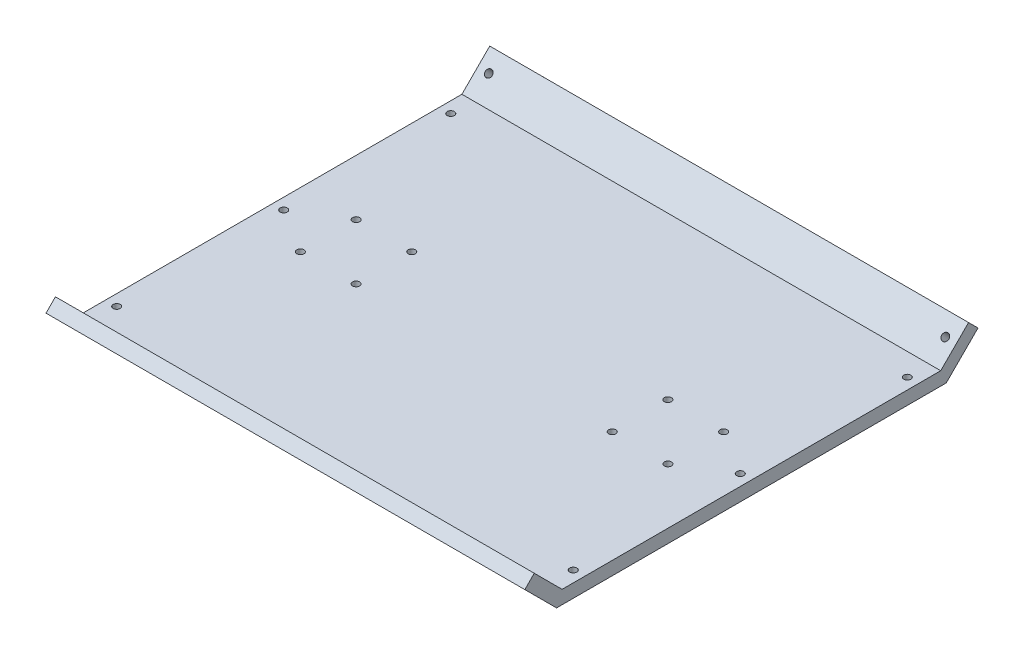
ISO-10303-21;
HEADER;
FILE_DESCRIPTION(('STEP AP214'),'2;1');
FILE_NAME('part.step','',(''),(''),'','','');
FILE_SCHEMA(('AUTOMOTIVE_DESIGN { 1 0 10303 214 1 1 1 1 }'));
ENDSEC;
DATA;
#1=APPLICATION_CONTEXT('core data for automotive mechanical design processes');
#2=APPLICATION_PROTOCOL_DEFINITION('international standard','automotive_design',2000,#1);
#3=PRODUCT_CONTEXT('',#1,'mechanical');
#4=PRODUCT('Part','Part','',(#3));
#5=PRODUCT_RELATED_PRODUCT_CATEGORY('part','',(#4));
#6=PRODUCT_DEFINITION_FORMATION('','',#4);
#7=PRODUCT_DEFINITION_CONTEXT('part definition',#1,'design');
#8=PRODUCT_DEFINITION('design','',#6,#7);
#9=PRODUCT_DEFINITION_SHAPE('','',#8);
#10=(LENGTH_UNIT() NAMED_UNIT(*) SI_UNIT(.MILLI.,.METRE.));
#11=(NAMED_UNIT(*) PLANE_ANGLE_UNIT() SI_UNIT($,.RADIAN.));
#12=(NAMED_UNIT(*) SI_UNIT($,.STERADIAN.) SOLID_ANGLE_UNIT());
#13=UNCERTAINTY_MEASURE_WITH_UNIT(LENGTH_MEASURE(1.E-05),#10,'distance_accuracy_value','');
#14=(GEOMETRIC_REPRESENTATION_CONTEXT(3) GLOBAL_UNCERTAINTY_ASSIGNED_CONTEXT((#13)) GLOBAL_UNIT_ASSIGNED_CONTEXT((#10,
#11,#12)) REPRESENTATION_CONTEXT('',''));
#15=CARTESIAN_POINT('',(0.,0.,0.));
#16=DIRECTION('',(0.,0.,1.));
#17=DIRECTION('',(1.,0.,0.));
#18=AXIS2_PLACEMENT_3D('',#15,#16,#17);
#19=CARTESIAN_POINT('',(107.5,8.25735931288064,101.742640687119));
#20=DIRECTION('',(0.,-0.707106781186547,-0.707106781186548));
#21=DIRECTION('',(0.,0.707106781186548,-0.707106781186547));
#22=AXIS2_PLACEMENT_3D('',#19,#20,#21);
#23=PLANE('',#22);
#24=DIRECTION('',(0.,-0.707106781186548,0.707106781186547));
#25=VECTOR('',#24,1.);
#26=CARTESIAN_POINT('',(-107.5,8.25735931288064,101.742640687119));
#27=LINE('',#26,#25);
#28=CARTESIAN_POINT('',(-107.5,12.4999999999999,97.5000000000001));
#29=VERTEX_POINT('',#28);
#30=CARTESIAN_POINT('',(-107.5,8.25735931288064,101.742640687119));
#31=VERTEX_POINT('',#30);
#32=EDGE_CURVE('E137',#29,#31,#27,.T.);
#33=ORIENTED_EDGE('',*,*,#32,.T.);
#34=DIRECTION('',(-1.,0.,0.));
#35=VECTOR('',#34,1.);
#36=CARTESIAN_POINT('',(107.5,8.25735931288064,101.742640687119));
#37=LINE('',#36,#35);
#38=CARTESIAN_POINT('',(107.5,8.25735931288064,101.742640687119));
#39=VERTEX_POINT('',#38);
#40=EDGE_CURVE('E11',#39,#31,#37,.T.);
#41=ORIENTED_EDGE('',*,*,#40,.F.);
#42=DIRECTION('',(0.,-0.707106781186548,0.707106781186547));
#43=VECTOR('',#42,1.);
#44=CARTESIAN_POINT('',(107.5,8.25735931288064,101.742640687119));
#45=LINE('',#44,#43);
#46=CARTESIAN_POINT('',(107.5,12.4999999999999,97.5000000000001));
#47=VERTEX_POINT('',#46);
#48=EDGE_CURVE('E152',#47,#39,#45,.T.);
#49=ORIENTED_EDGE('',*,*,#48,.F.);
#50=DIRECTION('',(-1.,0.,0.));
#51=VECTOR('',#50,1.);
#52=CARTESIAN_POINT('',(107.5,12.4999999999999,97.5000000000001));
#53=LINE('',#52,#51);
#54=EDGE_CURVE('E133',#47,#29,#53,.T.);
#55=ORIENTED_EDGE('',*,*,#54,.T.);
#56=EDGE_LOOP('',(#33,#41,#49,#55));
#57=FACE_BOUND('',#56,.T.);
#58=ADVANCED_FACE('F39',(#57),#23,.F.);
#59=CARTESIAN_POINT('',(107.5,-6.,87.4852813742388));
#60=DIRECTION('',(0.,0.707106781186544,-0.707106781186551));
#61=DIRECTION('',(0.,0.707106781186551,0.707106781186544));
#62=AXIS2_PLACEMENT_3D('',#59,#60,#61);
#63=PLANE('',#62);
#64=CARTESIAN_POINT('',(-102.5,2.82842712474614,96.3137084989849));
#65=DIRECTION('',(0.,0.707106781186544,-0.707106781186551));
#66=DIRECTION('',(0.,0.707106781186551,0.707106781186544));
#67=AXIS2_PLACEMENT_3D('',#64,#65,#66);
#68=CIRCLE('',#67,1.6);
#69=CARTESIAN_POINT('',(-102.5,3.95979797464463,97.4450793488833));
#70=VERTEX_POINT('',#69);
#71=EDGE_CURVE('E230',#70,#70,#68,.T.);
#72=ORIENTED_EDGE('',*,*,#71,.T.);
#73=EDGE_LOOP('',(#72));
#74=FACE_BOUND('',#73,.T.);
#75=CARTESIAN_POINT('',(102.5,2.82842712474614,96.3137084989849));
#76=DIRECTION('',(0.,0.707106781186544,-0.707106781186551));
#77=DIRECTION('',(0.,0.707106781186551,0.707106781186544));
#78=AXIS2_PLACEMENT_3D('',#75,#76,#77);
#79=CIRCLE('',#78,1.6);
#80=CARTESIAN_POINT('',(102.5,3.95979797464462,97.4450793488833));
#81=VERTEX_POINT('',#80);
#82=EDGE_CURVE('E236',#81,#81,#79,.T.);
#83=ORIENTED_EDGE('',*,*,#82,.T.);
#84=EDGE_LOOP('',(#83));
#85=FACE_BOUND('',#84,.T.);
#86=DIRECTION('',(0.,-0.707106781186551,-0.707106781186544));
#87=VECTOR('',#86,1.);
#88=CARTESIAN_POINT('',(-107.5,-6.,87.4852813742388));
#89=LINE('',#88,#87);
#90=CARTESIAN_POINT('',(-107.5,-6.,87.4852813742388));
#91=VERTEX_POINT('',#90);
#92=EDGE_CURVE('E140',#31,#91,#89,.T.);
#93=ORIENTED_EDGE('',*,*,#92,.T.);
#94=DIRECTION('',(-1.,0.,0.));
#95=VECTOR('',#94,1.);
#96=CARTESIAN_POINT('',(107.5,-6.,87.4852813742388));
#97=LINE('',#96,#95);
#98=CARTESIAN_POINT('',(107.5,-6.,87.4852813742388));
#99=VERTEX_POINT('',#98);
#100=EDGE_CURVE('E48',#99,#91,#97,.T.);
#101=ORIENTED_EDGE('',*,*,#100,.F.);
#102=DIRECTION('',(0.,-0.707106781186551,-0.707106781186544));
#103=VECTOR('',#102,1.);
#104=CARTESIAN_POINT('',(107.5,-6.,87.4852813742388));
#105=LINE('',#104,#103);
#106=EDGE_CURVE('E100',#39,#99,#105,.T.);
#107=ORIENTED_EDGE('',*,*,#106,.F.);
#108=ORIENTED_EDGE('',*,*,#40,.T.);
#109=EDGE_LOOP('',(#93,#101,#107,#108));
#110=FACE_BOUND('',#109,.T.);
#111=ADVANCED_FACE('F301',(#74,#85,#110),#63,.F.);
#112=CARTESIAN_POINT('',(107.5,-6.,87.4852813742388));
#113=DIRECTION('',(0.,1.,0.));
#114=DIRECTION('',(0.,0.,1.));
#115=AXIS2_PLACEMENT_3D('',#112,#113,#114);
#116=PLANE('',#115);
#117=CARTESIAN_POINT('',(-57.5,-6.,-12.5));
#118=DIRECTION('',(0.,1.,0.));
#119=DIRECTION('',(0.,0.,-1.));
#120=AXIS2_PLACEMENT_3D('',#117,#118,#119);
#121=CIRCLE('',#120,1.59999999999999);
#122=CARTESIAN_POINT('',(-57.5,-6.,-14.1));
#123=VERTEX_POINT('',#122);
#124=EDGE_CURVE('E448',#123,#123,#121,.T.);
#125=ORIENTED_EDGE('',*,*,#124,.T.);
#126=EDGE_LOOP('',(#125));
#127=FACE_BOUND('',#126,.T.);
#128=CARTESIAN_POINT('',(-82.5,-6.,-12.5));
#129=DIRECTION('',(0.,1.,0.));
#130=DIRECTION('',(0.,0.,-1.));
#131=AXIS2_PLACEMENT_3D('',#128,#129,#130);
#132=CIRCLE('',#131,1.59999999999999);
#133=CARTESIAN_POINT('',(-82.5,-6.,-14.1));
#134=VERTEX_POINT('',#133);
#135=EDGE_CURVE('E443',#134,#134,#132,.T.);
#136=ORIENTED_EDGE('',*,*,#135,.T.);
#137=EDGE_LOOP('',(#136));
#138=FACE_BOUND('',#137,.T.);
#139=CARTESIAN_POINT('',(-82.5,-6.,12.5));
#140=DIRECTION('',(0.,1.,0.));
#141=DIRECTION('',(0.,0.,-1.));
#142=AXIS2_PLACEMENT_3D('',#139,#140,#141);
#143=CIRCLE('',#142,1.59999999999999);
#144=CARTESIAN_POINT('',(-82.5,-6.,10.9));
#145=VERTEX_POINT('',#144);
#146=EDGE_CURVE('E406',#145,#145,#143,.T.);
#147=ORIENTED_EDGE('',*,*,#146,.T.);
#148=EDGE_LOOP('',(#147));
#149=FACE_BOUND('',#148,.T.);
#150=CARTESIAN_POINT('',(-57.5,-6.,12.5));
#151=DIRECTION('',(0.,1.,0.));
#152=DIRECTION('',(0.,0.,-1.));
#153=AXIS2_PLACEMENT_3D('',#150,#151,#152);
#154=CIRCLE('',#153,1.59999999999999);
#155=CARTESIAN_POINT('',(-57.5,-6.,10.9));
#156=VERTEX_POINT('',#155);
#157=EDGE_CURVE('E182',#156,#156,#154,.T.);
#158=ORIENTED_EDGE('',*,*,#157,.T.);
#159=EDGE_LOOP('',(#158));
#160=FACE_BOUND('',#159,.T.);
#161=CARTESIAN_POINT('',(57.5,-6.,-12.5));
#162=DIRECTION('',(0.,-1.,0.));
#163=DIRECTION('',(0.,0.,-1.));
#164=AXIS2_PLACEMENT_3D('',#161,#162,#163);
#165=CIRCLE('',#164,1.59999999999999);
#166=CARTESIAN_POINT('',(57.5,-6.,-14.1));
#167=VERTEX_POINT('',#166);
#168=EDGE_CURVE('E189',#167,#167,#165,.T.);
#169=ORIENTED_EDGE('',*,*,#168,.F.);
#170=EDGE_LOOP('',(#169));
#171=FACE_BOUND('',#170,.T.);
#172=CARTESIAN_POINT('',(82.5,-6.,-12.5));
#173=DIRECTION('',(0.,-1.,0.));
#174=DIRECTION('',(0.,0.,-1.));
#175=AXIS2_PLACEMENT_3D('',#172,#173,#174);
#176=CIRCLE('',#175,1.59999999999999);
#177=CARTESIAN_POINT('',(82.5,-6.,-14.1));
#178=VERTEX_POINT('',#177);
#179=EDGE_CURVE('E193',#178,#178,#176,.T.);
#180=ORIENTED_EDGE('',*,*,#179,.F.);
#181=EDGE_LOOP('',(#180));
#182=FACE_BOUND('',#181,.T.);
#183=CARTESIAN_POINT('',(82.5,-6.,12.5));
#184=DIRECTION('',(0.,-1.,0.));
#185=DIRECTION('',(0.,0.,-1.));
#186=AXIS2_PLACEMENT_3D('',#183,#184,#185);
#187=CIRCLE('',#186,1.59999999999999);
#188=CARTESIAN_POINT('',(82.5,-6.,10.9));
#189=VERTEX_POINT('',#188);
#190=EDGE_CURVE('E198',#189,#189,#187,.T.);
#191=ORIENTED_EDGE('',*,*,#190,.F.);
#192=EDGE_LOOP('',(#191));
#193=FACE_BOUND('',#192,.T.);
#194=CARTESIAN_POINT('',(57.5,-6.,12.5));
#195=DIRECTION('',(0.,-1.,0.));
#196=DIRECTION('',(0.,0.,-1.));
#197=AXIS2_PLACEMENT_3D('',#194,#195,#196);
#198=CIRCLE('',#197,1.59999999999999);
#199=CARTESIAN_POINT('',(57.5,-6.,10.9));
#200=VERTEX_POINT('',#199);
#201=EDGE_CURVE('E168',#200,#200,#198,.T.);
#202=ORIENTED_EDGE('',*,*,#201,.F.);
#203=EDGE_LOOP('',(#202));
#204=FACE_BOUND('',#203,.T.);
#205=CARTESIAN_POINT('',(-102.5,-6.,-75.0000000000001));
#206=DIRECTION('',(0.,1.,0.));
#207=DIRECTION('',(0.,0.,1.));
#208=AXIS2_PLACEMENT_3D('',#205,#206,#207);
#209=CIRCLE('',#208,1.6);
#210=CARTESIAN_POINT('',(-102.5,-6.,-73.4000000000001));
#211=VERTEX_POINT('',#210);
#212=EDGE_CURVE('E212',#211,#211,#209,.T.);
#213=ORIENTED_EDGE('',*,*,#212,.T.);
#214=EDGE_LOOP('',(#213));
#215=FACE_BOUND('',#214,.T.);
#216=CARTESIAN_POINT('',(-102.5,-6.,0.));
#217=DIRECTION('',(0.,1.,0.));
#218=DIRECTION('',(0.,0.,1.));
#219=AXIS2_PLACEMENT_3D('',#216,#217,#218);
#220=CIRCLE('',#219,1.6);
#221=CARTESIAN_POINT('',(-102.5,-6.,1.6));
#222=VERTEX_POINT('',#221);
#223=EDGE_CURVE('E218',#222,#222,#220,.T.);
#224=ORIENTED_EDGE('',*,*,#223,.T.);
#225=EDGE_LOOP('',(#224));
#226=FACE_BOUND('',#225,.T.);
#227=CARTESIAN_POINT('',(-102.5,-6.,75.0000000000001));
#228=DIRECTION('',(0.,1.,0.));
#229=DIRECTION('',(0.,0.,1.));
#230=AXIS2_PLACEMENT_3D('',#227,#228,#229);
#231=CIRCLE('',#230,1.6);
#232=CARTESIAN_POINT('',(-102.5,-6.,76.6000000000001));
#233=VERTEX_POINT('',#232);
#234=EDGE_CURVE('E224',#233,#233,#231,.T.);
#235=ORIENTED_EDGE('',*,*,#234,.T.);
#236=EDGE_LOOP('',(#235));
#237=FACE_BOUND('',#236,.T.);
#238=CARTESIAN_POINT('',(102.5,-6.,75.0000000000001));
#239=DIRECTION('',(0.,1.,0.));
#240=DIRECTION('',(0.,0.,1.));
#241=AXIS2_PLACEMENT_3D('',#238,#239,#240);
#242=CIRCLE('',#241,1.6);
#243=CARTESIAN_POINT('',(102.5,-6.,76.6000000000001));
#244=VERTEX_POINT('',#243);
#245=EDGE_CURVE('E242',#244,#244,#242,.T.);
#246=ORIENTED_EDGE('',*,*,#245,.T.);
#247=EDGE_LOOP('',(#246));
#248=FACE_BOUND('',#247,.T.);
#249=CARTESIAN_POINT('',(102.5,-6.,0.));
#250=DIRECTION('',(0.,1.,0.));
#251=DIRECTION('',(0.,0.,1.));
#252=AXIS2_PLACEMENT_3D('',#249,#250,#251);
#253=CIRCLE('',#252,1.6);
#254=CARTESIAN_POINT('',(102.5,-6.,1.6));
#255=VERTEX_POINT('',#254);
#256=EDGE_CURVE('E248',#255,#255,#253,.T.);
#257=ORIENTED_EDGE('',*,*,#256,.T.);
#258=EDGE_LOOP('',(#257));
#259=FACE_BOUND('',#258,.T.);
#260=CARTESIAN_POINT('',(102.5,-6.,-75.0000000000001));
#261=DIRECTION('',(0.,1.,0.));
#262=DIRECTION('',(0.,0.,1.));
#263=AXIS2_PLACEMENT_3D('',#260,#261,#262);
#264=CIRCLE('',#263,1.6);
#265=CARTESIAN_POINT('',(102.5,-6.,-73.4000000000001));
#266=VERTEX_POINT('',#265);
#267=EDGE_CURVE('E254',#266,#266,#264,.T.);
#268=ORIENTED_EDGE('',*,*,#267,.T.);
#269=EDGE_LOOP('',(#268));
#270=FACE_BOUND('',#269,.T.);
#271=DIRECTION('',(0.,0.,-1.));
#272=VECTOR('',#271,1.);
#273=CARTESIAN_POINT('',(-107.5,-6.,87.4852813742388));
#274=LINE('',#273,#272);
#275=CARTESIAN_POINT('',(-107.5,-6.,-87.4852813742387));
#276=VERTEX_POINT('',#275);
#277=EDGE_CURVE('E143',#91,#276,#274,.T.);
#278=ORIENTED_EDGE('',*,*,#277,.T.);
#279=DIRECTION('',(-1.,0.,0.));
#280=VECTOR('',#279,1.);
#281=CARTESIAN_POINT('',(107.5,-6.,-87.4852813742387));
#282=LINE('',#281,#280);
#283=CARTESIAN_POINT('',(107.5,-6.,-87.4852813742387));
#284=VERTEX_POINT('',#283);
#285=EDGE_CURVE('E159',#284,#276,#282,.T.);
#286=ORIENTED_EDGE('',*,*,#285,.F.);
#287=DIRECTION('',(0.,0.,-1.));
#288=VECTOR('',#287,1.);
#289=CARTESIAN_POINT('',(107.5,-6.,87.4852813742388));
#290=LINE('',#289,#288);
#291=EDGE_CURVE('E264',#99,#284,#290,.T.);
#292=ORIENTED_EDGE('',*,*,#291,.F.);
#293=ORIENTED_EDGE('',*,*,#100,.T.);
#294=EDGE_LOOP('',(#278,#286,#292,#293));
#295=FACE_BOUND('',#294,.T.);
#296=ADVANCED_FACE('F306',(#127,#138,#149,#160,#171,#182,#193,#204,#215,#226,#237,#248,#259,
#270,#295),#116,.F.);
#297=CARTESIAN_POINT('',(107.5,-6.,-87.4852813742387));
#298=DIRECTION('',(0.,0.707106781186548,0.707106781186547));
#299=DIRECTION('',(0.,-0.707106781186547,0.707106781186548));
#300=AXIS2_PLACEMENT_3D('',#297,#298,#299);
#301=PLANE('',#300);
#302=CARTESIAN_POINT('',(-102.5,2.8284271247462,-96.3137084989849));
#303=DIRECTION('',(0.,0.707106781186548,0.707106781186547));
#304=DIRECTION('',(0.,-0.707106781186547,0.707106781186548));
#305=AXIS2_PLACEMENT_3D('',#302,#303,#304);
#306=CIRCLE('',#305,1.6);
#307=CARTESIAN_POINT('',(-102.5,1.69705627484772,-95.1823376490864));
#308=VERTEX_POINT('',#307);
#309=EDGE_CURVE('E206',#308,#308,#306,.T.);
#310=ORIENTED_EDGE('',*,*,#309,.T.);
#311=EDGE_LOOP('',(#310));
#312=FACE_BOUND('',#311,.T.);
#313=CARTESIAN_POINT('',(102.5,2.8284271247462,-96.3137084989849));
#314=DIRECTION('',(0.,0.707106781186548,0.707106781186547));
#315=DIRECTION('',(0.,-0.707106781186547,0.707106781186548));
#316=AXIS2_PLACEMENT_3D('',#313,#314,#315);
#317=CIRCLE('',#316,1.6);
#318=CARTESIAN_POINT('',(102.5,1.69705627484772,-95.1823376490864));
#319=VERTEX_POINT('',#318);
#320=EDGE_CURVE('E141',#319,#319,#317,.T.);
#321=ORIENTED_EDGE('',*,*,#320,.T.);
#322=EDGE_LOOP('',(#321));
#323=FACE_BOUND('',#322,.T.);
#324=DIRECTION('',(0.,0.707106781186547,-0.707106781186548));
#325=VECTOR('',#324,1.);
#326=CARTESIAN_POINT('',(-107.5,-6.,-87.4852813742387));
#327=LINE('',#326,#325);
#328=CARTESIAN_POINT('',(-107.5,8.25735931288064,-101.742640687119));
#329=VERTEX_POINT('',#328);
#330=EDGE_CURVE('E145',#276,#329,#327,.T.);
#331=ORIENTED_EDGE('',*,*,#330,.T.);
#332=DIRECTION('',(-1.,0.,0.));
#333=VECTOR('',#332,1.);
#334=CARTESIAN_POINT('',(107.5,8.25735931288064,-101.742640687119));
#335=LINE('',#334,#333);
#336=CARTESIAN_POINT('',(107.5,8.25735931288064,-101.742640687119));
#337=VERTEX_POINT('',#336);
#338=EDGE_CURVE('E156',#337,#329,#335,.T.);
#339=ORIENTED_EDGE('',*,*,#338,.F.);
#340=DIRECTION('',(0.,0.707106781186547,-0.707106781186548));
#341=VECTOR('',#340,1.);
#342=CARTESIAN_POINT('',(107.5,-6.,-87.4852813742387));
#343=LINE('',#342,#341);
#344=EDGE_CURVE('E266',#284,#337,#343,.T.);
#345=ORIENTED_EDGE('',*,*,#344,.F.);
#346=ORIENTED_EDGE('',*,*,#285,.T.);
#347=EDGE_LOOP('',(#331,#339,#345,#346));
#348=FACE_BOUND('',#347,.T.);
#349=ADVANCED_FACE('F272',(#312,#323,#348),#301,.F.);
#350=CARTESIAN_POINT('',(107.5,12.5,-97.5));
#351=DIRECTION('',(0.,-0.707106781186547,0.707106781186548));
#352=DIRECTION('',(0.,-0.707106781186548,-0.707106781186547));
#353=AXIS2_PLACEMENT_3D('',#350,#351,#352);
#354=PLANE('',#353);
#355=DIRECTION('',(0.,0.707106781186548,0.707106781186547));
#356=VECTOR('',#355,1.);
#357=CARTESIAN_POINT('',(-107.5,12.5,-97.5));
#358=LINE('',#357,#356);
#359=CARTESIAN_POINT('',(-107.5,12.5,-97.5));
#360=VERTEX_POINT('',#359);
#361=EDGE_CURVE('E147',#329,#360,#358,.T.);
#362=ORIENTED_EDGE('',*,*,#361,.T.);
#363=DIRECTION('',(-1.,0.,0.));
#364=VECTOR('',#363,1.);
#365=CARTESIAN_POINT('',(107.5,12.5,-97.5));
#366=LINE('',#365,#364);
#367=CARTESIAN_POINT('',(107.5,12.5,-97.5));
#368=VERTEX_POINT('',#367);
#369=EDGE_CURVE('E128',#368,#360,#366,.T.);
#370=ORIENTED_EDGE('',*,*,#369,.F.);
#371=DIRECTION('',(0.,0.707106781186548,0.707106781186547));
#372=VECTOR('',#371,1.);
#373=CARTESIAN_POINT('',(107.5,12.5,-97.5));
#374=LINE('',#373,#372);
#375=EDGE_CURVE('E119',#337,#368,#374,.T.);
#376=ORIENTED_EDGE('',*,*,#375,.F.);
#377=ORIENTED_EDGE('',*,*,#338,.T.);
#378=EDGE_LOOP('',(#362,#370,#376,#377));
#379=FACE_BOUND('',#378,.T.);
#380=ADVANCED_FACE('F276',(#379),#354,.F.);
#381=CARTESIAN_POINT('',(107.5,0.,-85.0000000000001));
#382=DIRECTION('',(0.,-0.707106781186546,-0.707106781186549));
#383=DIRECTION('',(0.,0.707106781186549,-0.707106781186546));
#384=AXIS2_PLACEMENT_3D('',#381,#382,#383);
#385=PLANE('',#384);
#386=CARTESIAN_POINT('',(-102.5,7.07106781186546,-92.0710678118656));
#387=DIRECTION('',(0.,0.707106781186546,0.707106781186549));
#388=DIRECTION('',(0.,-0.707106781186549,0.707106781186546));
#389=AXIS2_PLACEMENT_3D('',#386,#387,#388);
#390=CIRCLE('',#389,1.6);
#391=CARTESIAN_POINT('',(-102.5,5.93969696196698,-90.9396969619671));
#392=VERTEX_POINT('',#391);
#393=EDGE_CURVE('E177',#392,#392,#390,.T.);
#394=ORIENTED_EDGE('',*,*,#393,.F.);
#395=EDGE_LOOP('',(#394));
#396=FACE_BOUND('',#395,.T.);
#397=CARTESIAN_POINT('',(102.5,7.07106781186546,-92.0710678118656));
#398=DIRECTION('',(0.,0.707106781186546,0.707106781186549));
#399=DIRECTION('',(0.,-0.707106781186549,0.707106781186546));
#400=AXIS2_PLACEMENT_3D('',#397,#398,#399);
#401=CIRCLE('',#400,1.6);
#402=CARTESIAN_POINT('',(102.5,5.93969696196698,-90.9396969619671));
#403=VERTEX_POINT('',#402);
#404=EDGE_CURVE('E257',#403,#403,#401,.T.);
#405=ORIENTED_EDGE('',*,*,#404,.F.);
#406=EDGE_LOOP('',(#405));
#407=FACE_BOUND('',#406,.T.);
#408=DIRECTION('',(0.,-0.707106781186549,0.707106781186546));
#409=VECTOR('',#408,1.);
#410=CARTESIAN_POINT('',(-107.5,0.,-85.0000000000001));
#411=LINE('',#410,#409);
#412=CARTESIAN_POINT('',(-107.5,0.,-85.0000000000001));
#413=VERTEX_POINT('',#412);
#414=EDGE_CURVE('E127',#360,#413,#411,.T.);
#415=ORIENTED_EDGE('',*,*,#414,.T.);
#416=DIRECTION('',(-1.,0.,0.));
#417=VECTOR('',#416,1.);
#418=CARTESIAN_POINT('',(107.5,0.,-85.0000000000001));
#419=LINE('',#418,#417);
#420=CARTESIAN_POINT('',(107.5,0.,-85.0000000000001));
#421=VERTEX_POINT('',#420);
#422=EDGE_CURVE('E124',#421,#413,#419,.T.);
#423=ORIENTED_EDGE('',*,*,#422,.F.);
#424=DIRECTION('',(0.,-0.707106781186549,0.707106781186546));
#425=VECTOR('',#424,1.);
#426=CARTESIAN_POINT('',(107.5,0.,-85.0000000000001));
#427=LINE('',#426,#425);
#428=EDGE_CURVE('E113',#368,#421,#427,.T.);
#429=ORIENTED_EDGE('',*,*,#428,.F.);
#430=ORIENTED_EDGE('',*,*,#369,.T.);
#431=EDGE_LOOP('',(#415,#423,#429,#430));
#432=FACE_BOUND('',#431,.T.);
#433=ADVANCED_FACE('F125',(#396,#407,#432),#385,.F.);
#434=CARTESIAN_POINT('',(107.5,0.,85.0000000000001));
#435=DIRECTION('',(0.,-1.,0.));
#436=DIRECTION('',(0.,0.,-1.));
#437=AXIS2_PLACEMENT_3D('',#434,#435,#436);
#438=PLANE('',#437);
#439=CARTESIAN_POINT('',(-57.5,0.,-12.5));
#440=DIRECTION('',(0.,-1.,0.));
#441=DIRECTION('',(0.,0.,-1.));
#442=AXIS2_PLACEMENT_3D('',#439,#440,#441);
#443=CIRCLE('',#442,1.59999999999999);
#444=CARTESIAN_POINT('',(-57.5,0.,-14.1));
#445=VERTEX_POINT('',#444);
#446=EDGE_CURVE('E42',#445,#445,#443,.F.);
#447=ORIENTED_EDGE('',*,*,#446,.F.);
#448=EDGE_LOOP('',(#447));
#449=FACE_BOUND('',#448,.T.);
#450=CARTESIAN_POINT('',(-82.5,0.,-12.5));
#451=DIRECTION('',(0.,-1.,0.));
#452=DIRECTION('',(0.,0.,-1.));
#453=AXIS2_PLACEMENT_3D('',#450,#451,#452);
#454=CIRCLE('',#453,1.59999999999999);
#455=CARTESIAN_POINT('',(-82.5,0.,-14.1));
#456=VERTEX_POINT('',#455);
#457=EDGE_CURVE('E184',#456,#456,#454,.F.);
#458=ORIENTED_EDGE('',*,*,#457,.F.);
#459=EDGE_LOOP('',(#458));
#460=FACE_BOUND('',#459,.T.);
#461=CARTESIAN_POINT('',(-82.5,0.,12.5));
#462=DIRECTION('',(0.,-1.,0.));
#463=DIRECTION('',(0.,0.,-1.));
#464=AXIS2_PLACEMENT_3D('',#461,#462,#463);
#465=CIRCLE('',#464,1.59999999999999);
#466=CARTESIAN_POINT('',(-82.5,0.,10.9));
#467=VERTEX_POINT('',#466);
#468=EDGE_CURVE('E181',#467,#467,#465,.F.);
#469=ORIENTED_EDGE('',*,*,#468,.F.);
#470=EDGE_LOOP('',(#469));
#471=FACE_BOUND('',#470,.T.);
#472=CARTESIAN_POINT('',(-57.5,0.,12.5));
#473=DIRECTION('',(0.,-1.,0.));
#474=DIRECTION('',(0.,0.,-1.));
#475=AXIS2_PLACEMENT_3D('',#472,#473,#474);
#476=CIRCLE('',#475,1.59999999999999);
#477=CARTESIAN_POINT('',(-57.5,0.,10.9));
#478=VERTEX_POINT('',#477);
#479=EDGE_CURVE('E178',#478,#478,#476,.F.);
#480=ORIENTED_EDGE('',*,*,#479,.F.);
#481=EDGE_LOOP('',(#480));
#482=FACE_BOUND('',#481,.T.);
#483=CARTESIAN_POINT('',(57.5,0.,-12.5));
#484=DIRECTION('',(0.,-1.,0.));
#485=DIRECTION('',(0.,0.,-1.));
#486=AXIS2_PLACEMENT_3D('',#483,#484,#485);
#487=CIRCLE('',#486,1.59999999999999);
#488=CARTESIAN_POINT('',(57.5,0.,-14.1));
#489=VERTEX_POINT('',#488);
#490=EDGE_CURVE('E174',#489,#489,#487,.T.);
#491=ORIENTED_EDGE('',*,*,#490,.T.);
#492=EDGE_LOOP('',(#491));
#493=FACE_BOUND('',#492,.T.);
#494=CARTESIAN_POINT('',(82.5,0.,-12.5));
#495=DIRECTION('',(0.,-1.,0.));
#496=DIRECTION('',(0.,0.,-1.));
#497=AXIS2_PLACEMENT_3D('',#494,#495,#496);
#498=CIRCLE('',#497,1.59999999999999);
#499=CARTESIAN_POINT('',(82.5,0.,-14.1));
#500=VERTEX_POINT('',#499);
#501=EDGE_CURVE('E171',#500,#500,#498,.T.);
#502=ORIENTED_EDGE('',*,*,#501,.T.);
#503=EDGE_LOOP('',(#502));
#504=FACE_BOUND('',#503,.T.);
#505=CARTESIAN_POINT('',(82.5,0.,12.5));
#506=DIRECTION('',(0.,-1.,0.));
#507=DIRECTION('',(0.,0.,-1.));
#508=AXIS2_PLACEMENT_3D('',#505,#506,#507);
#509=CIRCLE('',#508,1.59999999999999);
#510=CARTESIAN_POINT('',(82.5,0.,10.9));
#511=VERTEX_POINT('',#510);
#512=EDGE_CURVE('E167',#511,#511,#509,.T.);
#513=ORIENTED_EDGE('',*,*,#512,.T.);
#514=EDGE_LOOP('',(#513));
#515=FACE_BOUND('',#514,.T.);
#516=CARTESIAN_POINT('',(57.5,0.,12.5));
#517=DIRECTION('',(0.,-1.,0.));
#518=DIRECTION('',(0.,0.,-1.));
#519=AXIS2_PLACEMENT_3D('',#516,#517,#518);
#520=CIRCLE('',#519,1.59999999999999);
#521=CARTESIAN_POINT('',(57.5,0.,10.9));
#522=VERTEX_POINT('',#521);
#523=EDGE_CURVE('E164',#522,#522,#520,.T.);
#524=ORIENTED_EDGE('',*,*,#523,.T.);
#525=EDGE_LOOP('',(#524));
#526=FACE_BOUND('',#525,.T.);
#527=CARTESIAN_POINT('',(-102.5,0.,-75.0000000000001));
#528=DIRECTION('',(0.,1.,0.));
#529=DIRECTION('',(0.,0.,1.));
#530=AXIS2_PLACEMENT_3D('',#527,#528,#529);
#531=CIRCLE('',#530,1.6);
#532=CARTESIAN_POINT('',(-102.5,0.,-73.4000000000001));
#533=VERTEX_POINT('',#532);
#534=EDGE_CURVE('E209',#533,#533,#531,.T.);
#535=ORIENTED_EDGE('',*,*,#534,.F.);
#536=EDGE_LOOP('',(#535));
#537=FACE_BOUND('',#536,.T.);
#538=CARTESIAN_POINT('',(-102.5,0.,0.));
#539=DIRECTION('',(0.,1.,0.));
#540=DIRECTION('',(0.,0.,1.));
#541=AXIS2_PLACEMENT_3D('',#538,#539,#540);
#542=CIRCLE('',#541,1.6);
#543=CARTESIAN_POINT('',(-102.5,0.,1.6));
#544=VERTEX_POINT('',#543);
#545=EDGE_CURVE('E215',#544,#544,#542,.T.);
#546=ORIENTED_EDGE('',*,*,#545,.F.);
#547=EDGE_LOOP('',(#546));
#548=FACE_BOUND('',#547,.T.);
#549=CARTESIAN_POINT('',(-102.5,0.,75.0000000000001));
#550=DIRECTION('',(0.,1.,0.));
#551=DIRECTION('',(0.,0.,1.));
#552=AXIS2_PLACEMENT_3D('',#549,#550,#551);
#553=CIRCLE('',#552,1.6);
#554=CARTESIAN_POINT('',(-102.5,0.,76.6000000000001));
#555=VERTEX_POINT('',#554);
#556=EDGE_CURVE('E221',#555,#555,#553,.T.);
#557=ORIENTED_EDGE('',*,*,#556,.F.);
#558=EDGE_LOOP('',(#557));
#559=FACE_BOUND('',#558,.T.);
#560=CARTESIAN_POINT('',(102.5,0.,75.0000000000001));
#561=DIRECTION('',(0.,1.,0.));
#562=DIRECTION('',(0.,0.,1.));
#563=AXIS2_PLACEMENT_3D('',#560,#561,#562);
#564=CIRCLE('',#563,1.6);
#565=CARTESIAN_POINT('',(102.5,0.,76.6000000000001));
#566=VERTEX_POINT('',#565);
#567=EDGE_CURVE('E239',#566,#566,#564,.T.);
#568=ORIENTED_EDGE('',*,*,#567,.F.);
#569=EDGE_LOOP('',(#568));
#570=FACE_BOUND('',#569,.T.);
#571=CARTESIAN_POINT('',(102.5,0.,0.));
#572=DIRECTION('',(0.,1.,0.));
#573=DIRECTION('',(0.,0.,1.));
#574=AXIS2_PLACEMENT_3D('',#571,#572,#573);
#575=CIRCLE('',#574,1.6);
#576=CARTESIAN_POINT('',(102.5,0.,1.6));
#577=VERTEX_POINT('',#576);
#578=EDGE_CURVE('E245',#577,#577,#575,.T.);
#579=ORIENTED_EDGE('',*,*,#578,.F.);
#580=EDGE_LOOP('',(#579));
#581=FACE_BOUND('',#580,.T.);
#582=CARTESIAN_POINT('',(102.5,0.,-75.0000000000001));
#583=DIRECTION('',(0.,1.,0.));
#584=DIRECTION('',(0.,0.,1.));
#585=AXIS2_PLACEMENT_3D('',#582,#583,#584);
#586=CIRCLE('',#585,1.6);
#587=CARTESIAN_POINT('',(102.5,0.,-73.4000000000001));
#588=VERTEX_POINT('',#587);
#589=EDGE_CURVE('E251',#588,#588,#586,.T.);
#590=ORIENTED_EDGE('',*,*,#589,.F.);
#591=EDGE_LOOP('',(#590));
#592=FACE_BOUND('',#591,.T.);
#593=DIRECTION('',(0.,0.,1.));
#594=VECTOR('',#593,1.);
#595=CARTESIAN_POINT('',(-107.5,0.,85.0000000000001));
#596=LINE('',#595,#594);
#597=CARTESIAN_POINT('',(-107.5,0.,85.0000000000001));
#598=VERTEX_POINT('',#597);
#599=EDGE_CURVE('E86',#413,#598,#596,.T.);
#600=ORIENTED_EDGE('',*,*,#599,.T.);
#601=DIRECTION('',(-1.,0.,0.));
#602=VECTOR('',#601,1.);
#603=CARTESIAN_POINT('',(107.5,0.,85.0000000000001));
#604=LINE('',#603,#602);
#605=CARTESIAN_POINT('',(107.5,0.,85.0000000000001));
#606=VERTEX_POINT('',#605);
#607=EDGE_CURVE('E129',#606,#598,#604,.T.);
#608=ORIENTED_EDGE('',*,*,#607,.F.);
#609=DIRECTION('',(0.,0.,1.));
#610=VECTOR('',#609,1.);
#611=CARTESIAN_POINT('',(107.5,0.,85.0000000000001));
#612=LINE('',#611,#610);
#613=EDGE_CURVE('E117',#421,#606,#612,.T.);
#614=ORIENTED_EDGE('',*,*,#613,.F.);
#615=ORIENTED_EDGE('',*,*,#422,.T.);
#616=EDGE_LOOP('',(#600,#608,#614,#615));
#617=FACE_BOUND('',#616,.T.);
#618=ADVANCED_FACE('F131',(#449,#460,#471,#482,#493,#504,#515,#526,#537,#548,#559,#570,#581,
#592,#617),#438,.F.);
#619=CARTESIAN_POINT('',(107.5,0.,85.0000000000001));
#620=DIRECTION('',(0.,-0.707106781186551,0.707106781186544));
#621=DIRECTION('',(0.,-0.707106781186544,-0.707106781186551));
#622=AXIS2_PLACEMENT_3D('',#619,#620,#621);
#623=PLANE('',#622);
#624=CARTESIAN_POINT('',(-102.5,7.07106781186543,92.0710678118656));
#625=DIRECTION('',(0.,0.707106781186551,-0.707106781186544));
#626=DIRECTION('',(0.,0.707106781186544,0.707106781186551));
#627=AXIS2_PLACEMENT_3D('',#624,#625,#626);
#628=CIRCLE('',#627,1.6);
#629=CARTESIAN_POINT('',(-102.5,8.2024386617639,93.2024386617641));
#630=VERTEX_POINT('',#629);
#631=EDGE_CURVE('E227',#630,#630,#628,.T.);
#632=ORIENTED_EDGE('',*,*,#631,.F.);
#633=EDGE_LOOP('',(#632));
#634=FACE_BOUND('',#633,.T.);
#635=CARTESIAN_POINT('',(102.5,7.07106781186542,92.0710678118656));
#636=DIRECTION('',(0.,0.707106781186551,-0.707106781186544));
#637=DIRECTION('',(0.,0.707106781186544,0.707106781186551));
#638=AXIS2_PLACEMENT_3D('',#635,#636,#637);
#639=CIRCLE('',#638,1.6);
#640=CARTESIAN_POINT('',(102.5,8.20243866176389,93.2024386617641));
#641=VERTEX_POINT('',#640);
#642=EDGE_CURVE('E233',#641,#641,#639,.T.);
#643=ORIENTED_EDGE('',*,*,#642,.F.);
#644=EDGE_LOOP('',(#643));
#645=FACE_BOUND('',#644,.T.);
#646=DIRECTION('',(0.,0.707106781186544,0.707106781186551));
#647=VECTOR('',#646,1.);
#648=CARTESIAN_POINT('',(-107.5,0.,85.0000000000001));
#649=LINE('',#648,#647);
#650=EDGE_CURVE('E92',#598,#29,#649,.T.);
#651=ORIENTED_EDGE('',*,*,#650,.T.);
#652=ORIENTED_EDGE('',*,*,#54,.F.);
#653=DIRECTION('',(0.,0.707106781186544,0.707106781186551));
#654=VECTOR('',#653,1.);
#655=CARTESIAN_POINT('',(107.5,0.,85.0000000000001));
#656=LINE('',#655,#654);
#657=EDGE_CURVE('E57',#606,#47,#656,.T.);
#658=ORIENTED_EDGE('',*,*,#657,.F.);
#659=ORIENTED_EDGE('',*,*,#607,.T.);
#660=EDGE_LOOP('',(#651,#652,#658,#659));
#661=FACE_BOUND('',#660,.T.);
#662=ADVANCED_FACE('F284',(#634,#645,#661),#623,.F.);
#663=CARTESIAN_POINT('',(107.5,0.,0.));
#664=DIRECTION('',(1.,0.,0.));
#665=DIRECTION('',(0.,0.,-1.));
#666=AXIS2_PLACEMENT_3D('',#663,#664,#665);
#667=PLANE('',#666);
#668=ORIENTED_EDGE('',*,*,#48,.T.);
#669=ORIENTED_EDGE('',*,*,#106,.T.);
#670=ORIENTED_EDGE('',*,*,#291,.T.);
#671=ORIENTED_EDGE('',*,*,#344,.T.);
#672=ORIENTED_EDGE('',*,*,#375,.T.);
#673=ORIENTED_EDGE('',*,*,#428,.T.);
#674=ORIENTED_EDGE('',*,*,#613,.T.);
#675=ORIENTED_EDGE('',*,*,#657,.T.);
#676=EDGE_LOOP('',(#668,#669,#670,#671,#672,#673,#674,#675));
#677=FACE_BOUND('',#676,.T.);
#678=ADVANCED_FACE('F115',(#677),#667,.T.);
#679=CARTESIAN_POINT('',(-107.5,0.,0.));
#680=DIRECTION('',(1.,0.,0.));
#681=DIRECTION('',(0.,0.,-1.));
#682=AXIS2_PLACEMENT_3D('',#679,#680,#681);
#683=PLANE('',#682);
#684=ORIENTED_EDGE('',*,*,#32,.F.);
#685=ORIENTED_EDGE('',*,*,#650,.F.);
#686=ORIENTED_EDGE('',*,*,#599,.F.);
#687=ORIENTED_EDGE('',*,*,#414,.F.);
#688=ORIENTED_EDGE('',*,*,#361,.F.);
#689=ORIENTED_EDGE('',*,*,#330,.F.);
#690=ORIENTED_EDGE('',*,*,#277,.F.);
#691=ORIENTED_EDGE('',*,*,#92,.F.);
#692=EDGE_LOOP('',(#684,#685,#686,#687,#688,#689,#690,#691));
#693=FACE_BOUND('',#692,.T.);
#694=ADVANCED_FACE('F279',(#693),#683,.F.);
#695=CARTESIAN_POINT('',(102.5,7.07106781186546,-92.0710678118656));
#696=DIRECTION('',(0.,0.707106781186546,0.707106781186549));
#697=DIRECTION('',(0.,-0.707106781186549,0.707106781186546));
#698=AXIS2_PLACEMENT_3D('',#695,#696,#697);
#699=CYLINDRICAL_SURFACE('',#698,1.6);
#700=ORIENTED_EDGE('',*,*,#404,.T.);
#701=EDGE_LOOP('',(#700));
#702=FACE_BOUND('',#701,.T.);
#703=ORIENTED_EDGE('',*,*,#320,.F.);
#704=EDGE_LOOP('',(#703));
#705=FACE_BOUND('',#704,.T.);
#706=ADVANCED_FACE('F327',(#702,#705),#699,.F.);
#707=CARTESIAN_POINT('',(102.5,0.,-75.0000000000001));
#708=DIRECTION('',(0.,1.,0.));
#709=DIRECTION('',(0.,0.,1.));
#710=AXIS2_PLACEMENT_3D('',#707,#708,#709);
#711=CYLINDRICAL_SURFACE('',#710,1.6);
#712=ORIENTED_EDGE('',*,*,#267,.F.);
#713=EDGE_LOOP('',(#712));
#714=FACE_BOUND('',#713,.T.);
#715=ORIENTED_EDGE('',*,*,#589,.T.);
#716=EDGE_LOOP('',(#715));
#717=FACE_BOUND('',#716,.T.);
#718=ADVANCED_FACE('F329',(#714,#717),#711,.F.);
#719=CARTESIAN_POINT('',(102.5,0.,0.));
#720=DIRECTION('',(0.,1.,0.));
#721=DIRECTION('',(0.,0.,1.));
#722=AXIS2_PLACEMENT_3D('',#719,#720,#721);
#723=CYLINDRICAL_SURFACE('',#722,1.6);
#724=ORIENTED_EDGE('',*,*,#256,.F.);
#725=EDGE_LOOP('',(#724));
#726=FACE_BOUND('',#725,.T.);
#727=ORIENTED_EDGE('',*,*,#578,.T.);
#728=EDGE_LOOP('',(#727));
#729=FACE_BOUND('',#728,.T.);
#730=ADVANCED_FACE('F336',(#726,#729),#723,.F.);
#731=CARTESIAN_POINT('',(102.5,0.,75.0000000000001));
#732=DIRECTION('',(0.,1.,0.));
#733=DIRECTION('',(0.,0.,1.));
#734=AXIS2_PLACEMENT_3D('',#731,#732,#733);
#735=CYLINDRICAL_SURFACE('',#734,1.6);
#736=ORIENTED_EDGE('',*,*,#245,.F.);
#737=EDGE_LOOP('',(#736));
#738=FACE_BOUND('',#737,.T.);
#739=ORIENTED_EDGE('',*,*,#567,.T.);
#740=EDGE_LOOP('',(#739));
#741=FACE_BOUND('',#740,.T.);
#742=ADVANCED_FACE('F342',(#738,#741),#735,.F.);
#743=CARTESIAN_POINT('',(102.5,7.07106781186542,92.0710678118656));
#744=DIRECTION('',(0.,0.707106781186551,-0.707106781186544));
#745=DIRECTION('',(0.,0.707106781186544,0.707106781186551));
#746=AXIS2_PLACEMENT_3D('',#743,#744,#745);
#747=CYLINDRICAL_SURFACE('',#746,1.6);
#748=ORIENTED_EDGE('',*,*,#642,.T.);
#749=EDGE_LOOP('',(#748));
#750=FACE_BOUND('',#749,.T.);
#751=ORIENTED_EDGE('',*,*,#82,.F.);
#752=EDGE_LOOP('',(#751));
#753=FACE_BOUND('',#752,.T.);
#754=ADVANCED_FACE('F346',(#750,#753),#747,.F.);
#755=CARTESIAN_POINT('',(-102.5,7.07106781186543,92.0710678118656));
#756=DIRECTION('',(0.,0.707106781186551,-0.707106781186544));
#757=DIRECTION('',(0.,0.707106781186544,0.707106781186551));
#758=AXIS2_PLACEMENT_3D('',#755,#756,#757);
#759=CYLINDRICAL_SURFACE('',#758,1.6);
#760=ORIENTED_EDGE('',*,*,#631,.T.);
#761=EDGE_LOOP('',(#760));
#762=FACE_BOUND('',#761,.T.);
#763=ORIENTED_EDGE('',*,*,#71,.F.);
#764=EDGE_LOOP('',(#763));
#765=FACE_BOUND('',#764,.T.);
#766=ADVANCED_FACE('F350',(#762,#765),#759,.F.);
#767=CARTESIAN_POINT('',(-102.5,0.,75.0000000000001));
#768=DIRECTION('',(0.,1.,0.));
#769=DIRECTION('',(0.,0.,1.));
#770=AXIS2_PLACEMENT_3D('',#767,#768,#769);
#771=CYLINDRICAL_SURFACE('',#770,1.6);
#772=ORIENTED_EDGE('',*,*,#234,.F.);
#773=EDGE_LOOP('',(#772));
#774=FACE_BOUND('',#773,.T.);
#775=ORIENTED_EDGE('',*,*,#556,.T.);
#776=EDGE_LOOP('',(#775));
#777=FACE_BOUND('',#776,.T.);
#778=ADVANCED_FACE('F354',(#774,#777),#771,.F.);
#779=CARTESIAN_POINT('',(-102.5,0.,0.));
#780=DIRECTION('',(0.,1.,0.));
#781=DIRECTION('',(0.,0.,1.));
#782=AXIS2_PLACEMENT_3D('',#779,#780,#781);
#783=CYLINDRICAL_SURFACE('',#782,1.6);
#784=ORIENTED_EDGE('',*,*,#223,.F.);
#785=EDGE_LOOP('',(#784));
#786=FACE_BOUND('',#785,.T.);
#787=ORIENTED_EDGE('',*,*,#545,.T.);
#788=EDGE_LOOP('',(#787));
#789=FACE_BOUND('',#788,.T.);
#790=ADVANCED_FACE('F358',(#786,#789),#783,.F.);
#791=CARTESIAN_POINT('',(-102.5,0.,-75.0000000000001));
#792=DIRECTION('',(0.,1.,0.));
#793=DIRECTION('',(0.,0.,1.));
#794=AXIS2_PLACEMENT_3D('',#791,#792,#793);
#795=CYLINDRICAL_SURFACE('',#794,1.6);
#796=ORIENTED_EDGE('',*,*,#212,.F.);
#797=EDGE_LOOP('',(#796));
#798=FACE_BOUND('',#797,.T.);
#799=ORIENTED_EDGE('',*,*,#534,.T.);
#800=EDGE_LOOP('',(#799));
#801=FACE_BOUND('',#800,.T.);
#802=ADVANCED_FACE('F362',(#798,#801),#795,.F.);
#803=CARTESIAN_POINT('',(-102.5,7.07106781186546,-92.0710678118656));
#804=DIRECTION('',(0.,0.707106781186546,0.707106781186549));
#805=DIRECTION('',(0.,-0.707106781186549,0.707106781186546));
#806=AXIS2_PLACEMENT_3D('',#803,#804,#805);
#807=CYLINDRICAL_SURFACE('',#806,1.6);
#808=ORIENTED_EDGE('',*,*,#393,.T.);
#809=EDGE_LOOP('',(#808));
#810=FACE_BOUND('',#809,.T.);
#811=ORIENTED_EDGE('',*,*,#309,.F.);
#812=EDGE_LOOP('',(#811));
#813=FACE_BOUND('',#812,.T.);
#814=ADVANCED_FACE('F366',(#810,#813),#807,.F.);
#815=CARTESIAN_POINT('',(57.5,12.5,12.5));
#816=DIRECTION('',(0.,-1.,0.));
#817=DIRECTION('',(0.,0.,-1.));
#818=AXIS2_PLACEMENT_3D('',#815,#816,#817);
#819=CYLINDRICAL_SURFACE('',#818,1.59999999999999);
#820=ORIENTED_EDGE('',*,*,#201,.T.);
#821=EDGE_LOOP('',(#820));
#822=FACE_BOUND('',#821,.T.);
#823=ORIENTED_EDGE('',*,*,#523,.F.);
#824=EDGE_LOOP('',(#823));
#825=FACE_BOUND('',#824,.T.);
#826=ADVANCED_FACE('F370',(#822,#825),#819,.F.);
#827=CARTESIAN_POINT('',(82.5,12.5,12.5));
#828=DIRECTION('',(0.,-1.,0.));
#829=DIRECTION('',(0.,0.,-1.));
#830=AXIS2_PLACEMENT_3D('',#827,#828,#829);
#831=CYLINDRICAL_SURFACE('',#830,1.59999999999999);
#832=ORIENTED_EDGE('',*,*,#190,.T.);
#833=EDGE_LOOP('',(#832));
#834=FACE_BOUND('',#833,.T.);
#835=ORIENTED_EDGE('',*,*,#512,.F.);
#836=EDGE_LOOP('',(#835));
#837=FACE_BOUND('',#836,.T.);
#838=ADVANCED_FACE('F374',(#834,#837),#831,.F.);
#839=CARTESIAN_POINT('',(82.5,12.5,-12.5));
#840=DIRECTION('',(0.,-1.,0.));
#841=DIRECTION('',(0.,0.,-1.));
#842=AXIS2_PLACEMENT_3D('',#839,#840,#841);
#843=CYLINDRICAL_SURFACE('',#842,1.59999999999999);
#844=ORIENTED_EDGE('',*,*,#179,.T.);
#845=EDGE_LOOP('',(#844));
#846=FACE_BOUND('',#845,.T.);
#847=ORIENTED_EDGE('',*,*,#501,.F.);
#848=EDGE_LOOP('',(#847));
#849=FACE_BOUND('',#848,.T.);
#850=ADVANCED_FACE('F380',(#846,#849),#843,.F.);
#851=CARTESIAN_POINT('',(57.5,12.5,-12.5));
#852=DIRECTION('',(0.,-1.,0.));
#853=DIRECTION('',(0.,0.,-1.));
#854=AXIS2_PLACEMENT_3D('',#851,#852,#853);
#855=CYLINDRICAL_SURFACE('',#854,1.59999999999999);
#856=ORIENTED_EDGE('',*,*,#168,.T.);
#857=EDGE_LOOP('',(#856));
#858=FACE_BOUND('',#857,.T.);
#859=ORIENTED_EDGE('',*,*,#490,.F.);
#860=EDGE_LOOP('',(#859));
#861=FACE_BOUND('',#860,.T.);
#862=ADVANCED_FACE('F376',(#858,#861),#855,.F.);
#863=CARTESIAN_POINT('',(-57.5,12.5,12.5));
#864=DIRECTION('',(0.,-1.,0.));
#865=DIRECTION('',(0.,0.,-1.));
#866=AXIS2_PLACEMENT_3D('',#863,#864,#865);
#867=CYLINDRICAL_SURFACE('',#866,1.59999999999999);
#868=ORIENTED_EDGE('',*,*,#157,.F.);
#869=EDGE_LOOP('',(#868));
#870=FACE_BOUND('',#869,.T.);
#871=ORIENTED_EDGE('',*,*,#479,.T.);
#872=EDGE_LOOP('',(#871));
#873=FACE_BOUND('',#872,.T.);
#874=ADVANCED_FACE('F379',(#870,#873),#867,.F.);
#875=CARTESIAN_POINT('',(-82.5,12.5,12.5));
#876=DIRECTION('',(0.,-1.,0.));
#877=DIRECTION('',(0.,0.,-1.));
#878=AXIS2_PLACEMENT_3D('',#875,#876,#877);
#879=CYLINDRICAL_SURFACE('',#878,1.59999999999999);
#880=ORIENTED_EDGE('',*,*,#146,.F.);
#881=EDGE_LOOP('',(#880));
#882=FACE_BOUND('',#881,.T.);
#883=ORIENTED_EDGE('',*,*,#468,.T.);
#884=EDGE_LOOP('',(#883));
#885=FACE_BOUND('',#884,.T.);
#886=ADVANCED_FACE('F389',(#882,#885),#879,.F.);
#887=CARTESIAN_POINT('',(-82.5,12.5,-12.5));
#888=DIRECTION('',(0.,-1.,0.));
#889=DIRECTION('',(0.,0.,-1.));
#890=AXIS2_PLACEMENT_3D('',#887,#888,#889);
#891=CYLINDRICAL_SURFACE('',#890,1.59999999999999);
#892=ORIENTED_EDGE('',*,*,#135,.F.);
#893=EDGE_LOOP('',(#892));
#894=FACE_BOUND('',#893,.T.);
#895=ORIENTED_EDGE('',*,*,#457,.T.);
#896=EDGE_LOOP('',(#895));
#897=FACE_BOUND('',#896,.T.);
#898=ADVANCED_FACE('F394',(#894,#897),#891,.F.);
#899=CARTESIAN_POINT('',(-57.5,12.5,-12.5));
#900=DIRECTION('',(0.,-1.,0.));
#901=DIRECTION('',(0.,0.,-1.));
#902=AXIS2_PLACEMENT_3D('',#899,#900,#901);
#903=CYLINDRICAL_SURFACE('',#902,1.59999999999999);
#904=ORIENTED_EDGE('',*,*,#124,.F.);
#905=EDGE_LOOP('',(#904));
#906=FACE_BOUND('',#905,.T.);
#907=ORIENTED_EDGE('',*,*,#446,.T.);
#908=EDGE_LOOP('',(#907));
#909=FACE_BOUND('',#908,.T.);
#910=ADVANCED_FACE('F391',(#906,#909),#903,.F.);
#911=CLOSED_SHELL('',(#58,#111,#296,#349,#380,#433,#618,#662,#678,#694,#706,#718,#730,#742,#754,
#766,#778,#790,#802,#814,#826,#838,#850,#862,#874,#886,#898,#910));
#912=MANIFOLD_SOLID_BREP('B2',#911);
#913=ADVANCED_BREP_SHAPE_REPRESENTATION('',(#18,#912),#14);
#914=SHAPE_DEFINITION_REPRESENTATION(#9,#913);
ENDSEC;
END-ISO-10303-21;
